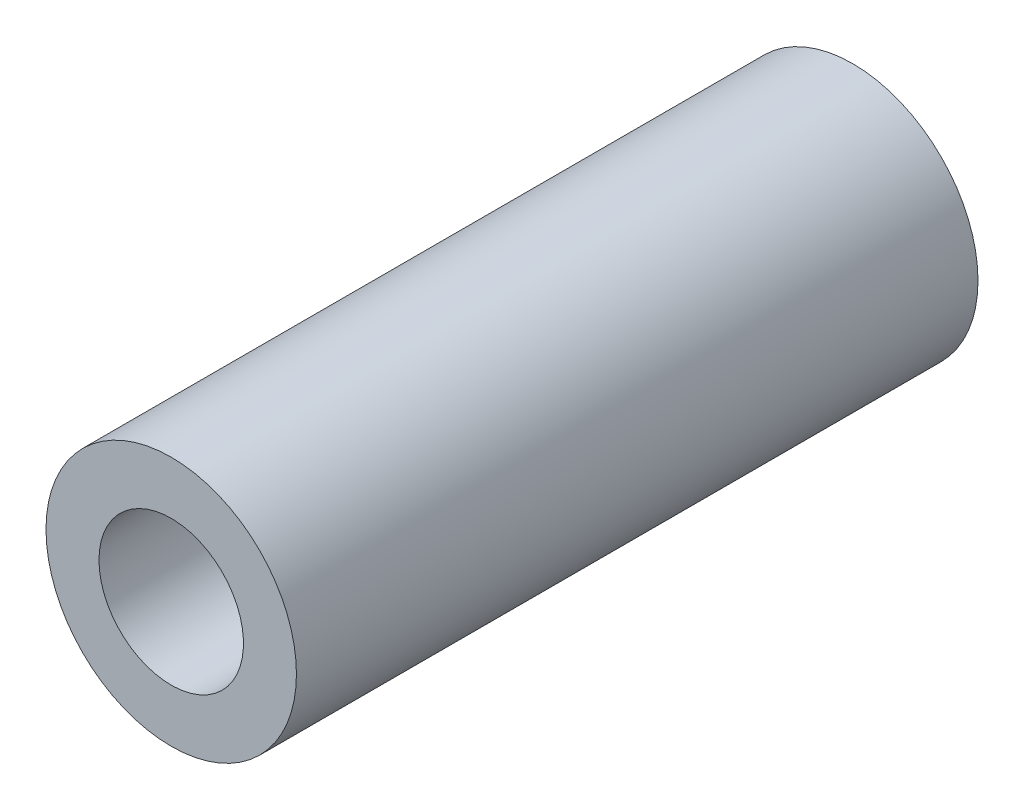
ISO-10303-21;
HEADER;
FILE_DESCRIPTION(('STEP AP214'),'2;1');
FILE_NAME('part.step','',(''),(''),'','','');
FILE_SCHEMA(('AUTOMOTIVE_DESIGN { 1 0 10303 214 1 1 1 1 }'));
ENDSEC;
DATA;
#1=APPLICATION_CONTEXT('core data for automotive mechanical design processes');
#2=APPLICATION_PROTOCOL_DEFINITION('international standard','automotive_design',2000,#1);
#3=PRODUCT_CONTEXT('',#1,'mechanical');
#4=PRODUCT('Part','Part','',(#3));
#5=PRODUCT_RELATED_PRODUCT_CATEGORY('part','',(#4));
#6=PRODUCT_DEFINITION_FORMATION('','',#4);
#7=PRODUCT_DEFINITION_CONTEXT('part definition',#1,'design');
#8=PRODUCT_DEFINITION('design','',#6,#7);
#9=PRODUCT_DEFINITION_SHAPE('','',#8);
#10=(LENGTH_UNIT() NAMED_UNIT(*) SI_UNIT(.MILLI.,.METRE.));
#11=(NAMED_UNIT(*) PLANE_ANGLE_UNIT() SI_UNIT($,.RADIAN.));
#12=(NAMED_UNIT(*) SI_UNIT($,.STERADIAN.) SOLID_ANGLE_UNIT());
#13=UNCERTAINTY_MEASURE_WITH_UNIT(LENGTH_MEASURE(1.E-05),#10,'distance_accuracy_value','');
#14=(GEOMETRIC_REPRESENTATION_CONTEXT(3) GLOBAL_UNCERTAINTY_ASSIGNED_CONTEXT((#13)) GLOBAL_UNIT_ASSIGNED_CONTEXT((#10,
#11,#12)) REPRESENTATION_CONTEXT('',''));
#15=CARTESIAN_POINT('',(0.,0.,0.));
#16=DIRECTION('',(0.,0.,1.));
#17=DIRECTION('',(1.,0.,0.));
#18=AXIS2_PLACEMENT_3D('',#15,#16,#17);
#19=CARTESIAN_POINT('',(0.,0.,19.05));
#20=DIRECTION('',(0.,0.,-1.));
#21=DIRECTION('',(-1.,0.,0.));
#22=AXIS2_PLACEMENT_3D('',#19,#20,#21);
#23=CYLINDRICAL_SURFACE('',#22,3.5);
#24=CARTESIAN_POINT('',(0.,0.,19.05));
#25=DIRECTION('',(0.,0.,1.));
#26=DIRECTION('',(1.,0.,0.));
#27=AXIS2_PLACEMENT_3D('',#24,#25,#26);
#28=CIRCLE('',#27,3.5);
#29=CARTESIAN_POINT('',(3.5,0.,19.05));
#30=VERTEX_POINT('',#29);
#31=EDGE_CURVE('E10',#30,#30,#28,.T.);
#32=ORIENTED_EDGE('',*,*,#31,.F.);
#33=EDGE_LOOP('',(#32));
#34=FACE_BOUND('',#33,.T.);
#35=CARTESIAN_POINT('',(0.,0.,0.));
#36=DIRECTION('',(0.,0.,1.));
#37=DIRECTION('',(1.,0.,0.));
#38=AXIS2_PLACEMENT_3D('',#35,#36,#37);
#39=CIRCLE('',#38,3.5);
#40=CARTESIAN_POINT('',(3.5,0.,0.));
#41=VERTEX_POINT('',#40);
#42=EDGE_CURVE('E23',#41,#41,#39,.T.);
#43=ORIENTED_EDGE('',*,*,#42,.T.);
#44=EDGE_LOOP('',(#43));
#45=FACE_BOUND('',#44,.T.);
#46=ADVANCED_FACE('F15',(#34,#45),#23,.T.);
#47=CARTESIAN_POINT('',(0.,0.,19.05));
#48=DIRECTION('',(0.,0.,1.));
#49=DIRECTION('',(1.,0.,0.));
#50=AXIS2_PLACEMENT_3D('',#47,#48,#49);
#51=PLANE('',#50);
#52=CARTESIAN_POINT('',(0.,0.,19.05));
#53=DIRECTION('',(0.,0.,-1.));
#54=DIRECTION('',(-1.,0.,0.));
#55=AXIS2_PLACEMENT_3D('',#52,#53,#54);
#56=CIRCLE('',#55,2.0193);
#57=CARTESIAN_POINT('',(-2.0193,0.,19.05));
#58=VERTEX_POINT('',#57);
#59=EDGE_CURVE('E31',#58,#58,#56,.T.);
#60=ORIENTED_EDGE('',*,*,#59,.T.);
#61=EDGE_LOOP('',(#60));
#62=FACE_BOUND('',#61,.T.);
#63=ORIENTED_EDGE('',*,*,#31,.T.);
#64=EDGE_LOOP('',(#63));
#65=FACE_BOUND('',#64,.T.);
#66=ADVANCED_FACE('F45',(#62,#65),#51,.T.);
#67=CARTESIAN_POINT('',(0.,0.,0.));
#68=DIRECTION('',(0.,0.,1.));
#69=DIRECTION('',(1.,0.,0.));
#70=AXIS2_PLACEMENT_3D('',#67,#68,#69);
#71=PLANE('',#70);
#72=CARTESIAN_POINT('',(0.,0.,0.));
#73=DIRECTION('',(0.,0.,1.));
#74=DIRECTION('',(1.,0.,0.));
#75=AXIS2_PLACEMENT_3D('',#72,#73,#74);
#76=CIRCLE('',#75,2.0193);
#77=CARTESIAN_POINT('',(2.0193,0.,0.));
#78=VERTEX_POINT('',#77);
#79=EDGE_CURVE('E18',#78,#78,#76,.F.);
#80=ORIENTED_EDGE('',*,*,#79,.F.);
#81=EDGE_LOOP('',(#80));
#82=FACE_BOUND('',#81,.T.);
#83=ORIENTED_EDGE('',*,*,#42,.F.);
#84=EDGE_LOOP('',(#83));
#85=FACE_BOUND('',#84,.T.);
#86=ADVANCED_FACE('F42',(#82,#85),#71,.F.);
#87=CARTESIAN_POINT('',(0.,0.,19.05));
#88=DIRECTION('',(0.,0.,-1.));
#89=DIRECTION('',(-1.,0.,0.));
#90=AXIS2_PLACEMENT_3D('',#87,#88,#89);
#91=CYLINDRICAL_SURFACE('',#90,2.0193);
#92=ORIENTED_EDGE('',*,*,#59,.F.);
#93=EDGE_LOOP('',(#92));
#94=FACE_BOUND('',#93,.T.);
#95=ORIENTED_EDGE('',*,*,#79,.T.);
#96=EDGE_LOOP('',(#95));
#97=FACE_BOUND('',#96,.T.);
#98=ADVANCED_FACE('F40',(#94,#97),#91,.F.);
#99=CLOSED_SHELL('',(#46,#66,#86,#98));
#100=MANIFOLD_SOLID_BREP('B1',#99);
#101=ADVANCED_BREP_SHAPE_REPRESENTATION('',(#18,#100),#14);
#102=SHAPE_DEFINITION_REPRESENTATION(#9,#101);
ENDSEC;
END-ISO-10303-21;
